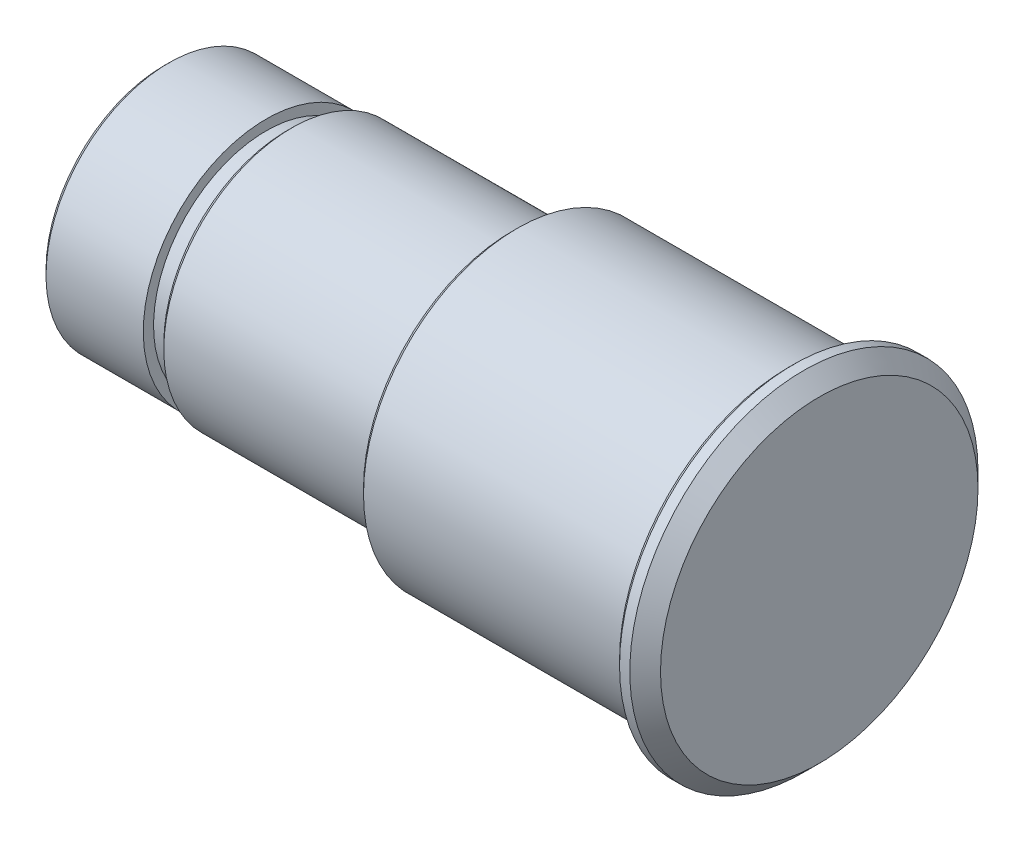
ISO-10303-21;
HEADER;
FILE_DESCRIPTION(('STEP AP214'),'2;1');
FILE_NAME('part.step','',(''),(''),'','','');
FILE_SCHEMA(('AUTOMOTIVE_DESIGN { 1 0 10303 214 1 1 1 1 }'));
ENDSEC;
DATA;
#1=APPLICATION_CONTEXT('core data for automotive mechanical design processes');
#2=APPLICATION_PROTOCOL_DEFINITION('international standard','automotive_design',2000,#1);
#3=PRODUCT_CONTEXT('',#1,'mechanical');
#4=PRODUCT('Part','Part','',(#3));
#5=PRODUCT_RELATED_PRODUCT_CATEGORY('part','',(#4));
#6=PRODUCT_DEFINITION_FORMATION('','',#4);
#7=PRODUCT_DEFINITION_CONTEXT('part definition',#1,'design');
#8=PRODUCT_DEFINITION('design','',#6,#7);
#9=PRODUCT_DEFINITION_SHAPE('','',#8);
#10=(LENGTH_UNIT() NAMED_UNIT(*) SI_UNIT(.MILLI.,.METRE.));
#11=(NAMED_UNIT(*) PLANE_ANGLE_UNIT() SI_UNIT($,.RADIAN.));
#12=(NAMED_UNIT(*) SI_UNIT($,.STERADIAN.) SOLID_ANGLE_UNIT());
#13=UNCERTAINTY_MEASURE_WITH_UNIT(LENGTH_MEASURE(1.E-05),#10,'distance_accuracy_value','');
#14=(GEOMETRIC_REPRESENTATION_CONTEXT(3) GLOBAL_UNCERTAINTY_ASSIGNED_CONTEXT((#13)) GLOBAL_UNIT_ASSIGNED_CONTEXT((#10,
#11,#12)) REPRESENTATION_CONTEXT('',''));
#15=CARTESIAN_POINT('',(0.,0.,0.));
#16=DIRECTION('',(0.,0.,1.));
#17=DIRECTION('',(1.,0.,0.));
#18=AXIS2_PLACEMENT_3D('',#15,#16,#17);
#19=CARTESIAN_POINT('',(0.,0.,0.));
#20=DIRECTION('',(-1.,0.,0.));
#21=DIRECTION('',(0.,0.,1.));
#22=AXIS2_PLACEMENT_3D('',#19,#20,#21);
#23=PLANE('',#22);
#24=DIRECTION('',(0.,1.,0.));
#25=VECTOR('',#24,1.);
#26=CARTESIAN_POINT('',(0.,-17.001,-2.5));
#27=LINE('',#26,#25);
#28=CARTESIAN_POINT('',(0.,-11.2249721603218,-2.5));
#29=VERTEX_POINT('',#28);
#30=CARTESIAN_POINT('',(0.,-9.,-2.5));
#31=VERTEX_POINT('',#30);
#32=EDGE_CURVE('E103',#29,#31,#27,.T.);
#33=ORIENTED_EDGE('',*,*,#32,.T.);
#34=DIRECTION('',(0.,0.,1.));
#35=VECTOR('',#34,1.);
#36=CARTESIAN_POINT('',(0.,-9.,2.5));
#37=LINE('',#36,#35);
#38=CARTESIAN_POINT('',(0.,-9.,2.5));
#39=VERTEX_POINT('',#38);
#40=EDGE_CURVE('E123',#31,#39,#37,.T.);
#41=ORIENTED_EDGE('',*,*,#40,.T.);
#42=DIRECTION('',(0.,1.,0.));
#43=VECTOR('',#42,1.);
#44=CARTESIAN_POINT('',(0.,-17.001,2.5));
#45=LINE('',#44,#43);
#46=CARTESIAN_POINT('',(0.,-11.2249721603218,2.5));
#47=VERTEX_POINT('',#46);
#48=EDGE_CURVE('E122',#47,#39,#45,.T.);
#49=ORIENTED_EDGE('',*,*,#48,.F.);
#50=CARTESIAN_POINT('',(0.,0.,0.));
#51=DIRECTION('',(-1.,0.,0.));
#52=DIRECTION('',(0.,0.,1.));
#53=AXIS2_PLACEMENT_3D('',#50,#51,#52);
#54=CIRCLE('',#53,11.5);
#55=EDGE_CURVE('E11',#47,#29,#54,.T.);
#56=ORIENTED_EDGE('',*,*,#55,.T.);
#57=EDGE_LOOP('',(#33,#41,#49,#56));
#58=FACE_BOUND('',#57,.T.);
#59=ADVANCED_FACE('F39',(#58),#23,.T.);
#60=CARTESIAN_POINT('',(0.,0.,0.));
#61=DIRECTION('',(1.,0.,0.));
#62=DIRECTION('',(0.,0.,-1.));
#63=AXIS2_PLACEMENT_3D('',#60,#61,#62);
#64=CYLINDRICAL_SURFACE('',#63,12.);
#65=DIRECTION('',(1.,0.,0.));
#66=VECTOR('',#65,1.);
#67=CARTESIAN_POINT('',(0.,-11.7366945943055,-2.5));
#68=LINE('',#67,#66);
#69=CARTESIAN_POINT('',(9.5,-11.7366945943055,-2.5));
#70=VERTEX_POINT('',#69);
#71=CARTESIAN_POINT('',(0.500000000000009,-11.7366945943055,-2.5));
#72=VERTEX_POINT('',#71);
#73=EDGE_CURVE('E180',#70,#72,#68,.F.);
#74=ORIENTED_EDGE('',*,*,#73,.T.);
#75=CARTESIAN_POINT('',(0.500000000000009,0.,0.));
#76=DIRECTION('',(-1.,0.,0.));
#77=DIRECTION('',(0.,0.,1.));
#78=AXIS2_PLACEMENT_3D('',#75,#76,#77);
#79=CIRCLE('',#78,12.);
#80=CARTESIAN_POINT('',(0.500000000000009,-11.7366945943055,2.5));
#81=VERTEX_POINT('',#80);
#82=EDGE_CURVE('E48',#72,#81,#79,.F.);
#83=ORIENTED_EDGE('',*,*,#82,.T.);
#84=DIRECTION('',(1.,0.,0.));
#85=VECTOR('',#84,1.);
#86=CARTESIAN_POINT('',(0.,-11.7366945943055,2.5));
#87=LINE('',#86,#85);
#88=CARTESIAN_POINT('',(9.5,-11.7366945943055,2.5));
#89=VERTEX_POINT('',#88);
#90=EDGE_CURVE('E55',#81,#89,#87,.T.);
#91=ORIENTED_EDGE('',*,*,#90,.T.);
#92=CARTESIAN_POINT('',(9.5,-11.7366945943055,2.5));
#93=CARTESIAN_POINT('',(9.58421858663514,-11.7367140999484,2.49997489475119));
#94=CARTESIAN_POINT('',(9.66799454675436,-11.7376109802893,2.49575315399786));
#95=CARTESIAN_POINT('',(9.83466121341523,-11.7411594903559,2.47891640153729));
#96=CARTESIAN_POINT('',(9.91755191996268,-11.74381112007,2.46630138988501));
#97=CARTESIAN_POINT('',(10.,-11.7473401244707,2.44948974278318));
#98=B_SPLINE_CURVE_WITH_KNOTS('',3,(#92,#93,#94,#95,#96,#97),.UNSPECIFIED.,.F.,.F.,(4,2,4),(0.,
0.251661182642632,0.503322363637155),.UNSPECIFIED.);
#99=CARTESIAN_POINT('',(10.,-11.7473401244707,2.44948974278318));
#100=VERTEX_POINT('',#99);
#101=EDGE_CURVE('E119',#89,#100,#98,.T.);
#102=ORIENTED_EDGE('',*,*,#101,.T.);
#103=CARTESIAN_POINT('',(10.,0.,0.));
#104=DIRECTION('',(1.,0.,0.));
#105=DIRECTION('',(0.,0.,-1.));
#106=AXIS2_PLACEMENT_3D('',#103,#104,#105);
#107=CIRCLE('',#106,12.);
#108=CARTESIAN_POINT('',(10.,-11.7473401244707,-2.44948974278318));
#109=VERTEX_POINT('',#108);
#110=EDGE_CURVE('E219',#109,#100,#107,.T.);
#111=ORIENTED_EDGE('',*,*,#110,.F.);
#112=CARTESIAN_POINT('',(10.,-11.7473401244707,-2.44948974278318));
#113=CARTESIAN_POINT('',(9.91755191996268,-11.74381112007,-2.46630138988501));
#114=CARTESIAN_POINT('',(9.83466121341523,-11.7411594903559,-2.47891640153729));
#115=CARTESIAN_POINT('',(9.66799454675437,-11.7376109802893,-2.49575315399786));
#116=CARTESIAN_POINT('',(9.58421858663515,-11.7367140999484,-2.49997489475119));
#117=CARTESIAN_POINT('',(9.5,-11.7366945943055,-2.5));
#118=B_SPLINE_CURVE_WITH_KNOTS('',3,(#112,#113,#114,#115,#116,#117),.UNSPECIFIED.,.F.,.F.,(4,2,
4),(0.,0.251661180994519,0.503322363637153),.UNSPECIFIED.);
#119=EDGE_CURVE('E173',#109,#70,#118,.T.);
#120=ORIENTED_EDGE('',*,*,#119,.T.);
#121=EDGE_LOOP('',(#74,#83,#91,#102,#111,#120));
#122=FACE_BOUND('',#121,.T.);
#123=ADVANCED_FACE('F191',(#122),#64,.T.);
#124=CARTESIAN_POINT('',(10.,12.,0.));
#125=DIRECTION('',(1.,0.,0.));
#126=DIRECTION('',(0.,0.,-1.));
#127=AXIS2_PLACEMENT_3D('',#124,#125,#126);
#128=PLANE('',#127);
#129=DIRECTION('',(0.,1.,0.));
#130=VECTOR('',#129,1.);
#131=CARTESIAN_POINT('',(10.,-17.001,-2.44948974278318));
#132=LINE('',#131,#130);
#133=CARTESIAN_POINT('',(10.,-10.7238052947636,-2.44948974278318));
#134=VERTEX_POINT('',#133);
#135=EDGE_CURVE('E199',#134,#109,#132,.F.);
#136=ORIENTED_EDGE('',*,*,#135,.T.);
#137=ORIENTED_EDGE('',*,*,#110,.T.);
#138=DIRECTION('',(0.,1.,0.));
#139=VECTOR('',#138,1.);
#140=CARTESIAN_POINT('',(10.,-17.001,2.44948974278318));
#141=LINE('',#140,#139);
#142=CARTESIAN_POINT('',(10.,-10.7238052947636,2.44948974278318));
#143=VERTEX_POINT('',#142);
#144=EDGE_CURVE('E208',#100,#143,#141,.T.);
#145=ORIENTED_EDGE('',*,*,#144,.T.);
#146=CARTESIAN_POINT('',(10.,0.,0.));
#147=DIRECTION('',(1.,0.,0.));
#148=DIRECTION('',(0.,0.,-1.));
#149=AXIS2_PLACEMENT_3D('',#146,#147,#148);
#150=CIRCLE('',#149,11.);
#151=EDGE_CURVE('E217',#134,#143,#150,.T.);
#152=ORIENTED_EDGE('',*,*,#151,.F.);
#153=EDGE_LOOP('',(#136,#137,#145,#152));
#154=FACE_BOUND('',#153,.T.);
#155=ADVANCED_FACE('F280',(#154),#128,.T.);
#156=CARTESIAN_POINT('',(0.,0.,0.));
#157=DIRECTION('',(1.,0.,0.));
#158=DIRECTION('',(0.,0.,-1.));
#159=AXIS2_PLACEMENT_3D('',#156,#157,#158);
#160=CYLINDRICAL_SURFACE('',#159,11.);
#161=CARTESIAN_POINT('',(10.,-10.7238052947636,2.44948974278318));
#162=CARTESIAN_POINT('',(10.0687658541219,-10.7270056140935,2.43546029800012));
#163=CARTESIAN_POINT('',(10.1369024025991,-10.7308483129835,2.41852849317044));
#164=CARTESIAN_POINT('',(10.2714339922325,-10.7396759330596,2.37903219978379));
#165=CARTESIAN_POINT('',(10.3378293544249,-10.7446606420105,2.35646875776078));
#166=CARTESIAN_POINT('',(10.4683290356998,-10.7556232664351,2.3059117370436));
#167=CARTESIAN_POINT('',(10.5324364679775,-10.7615997644778,2.27792589842313));
#168=CARTESIAN_POINT('',(10.6580046328132,-10.7743708943376,2.21673402022404));
#169=CARTESIAN_POINT('',(10.7194652993342,-10.7811655465517,2.18352785049374));
#170=CARTESIAN_POINT('',(10.8992302745031,-10.802487441033,2.07643102930596));
#171=CARTESIAN_POINT('',(11.0130549552139,-10.8179647932573,1.99500860974427));
#172=CARTESIAN_POINT('',(11.2254548650035,-10.8497057285349,1.81446040223466));
#173=CARTESIAN_POINT('',(11.3240279673745,-10.8659694208225,1.7153321494977));
#174=CARTESIAN_POINT('',(11.5046141676335,-10.8977273916412,1.50048852036224));
#175=CARTESIAN_POINT('',(11.5863835486118,-10.913208181084,1.38456569984476));
#176=CARTESIAN_POINT('',(11.7292834613016,-10.9414247771705,1.1403141507048));
#177=CARTESIAN_POINT('',(11.7904137955471,-10.9541605575507,1.01198530340163));
#178=CARTESIAN_POINT('',(11.8897789476618,-10.9753675759204,0.747502423487413));
#179=CARTESIAN_POINT('',(11.9281808789883,-10.9838698657884,0.611413782178589));
#180=CARTESIAN_POINT('',(11.9815268235188,-10.9957850389368,0.334509194933948));
#181=CARTESIAN_POINT('',(11.9964754107153,-10.9991989145795,0.193694176233572));
#182=CARTESIAN_POINT('',(12.0023505810677,-11.0005342905738,-0.0853038567361098));
#183=CARTESIAN_POINT('',(11.9938061401631,-10.9985767376126,-0.223475426347411));
#184=CARTESIAN_POINT('',(11.9541061833004,-10.9896436624435,-0.496360415596153));
#185=CARTESIAN_POINT('',(11.9229504646779,-10.9826680952593,-0.63107380422679));
#186=CARTESIAN_POINT('',(11.8391470519055,-10.9644859951713,-0.892877436761513));
#187=CARTESIAN_POINT('',(11.7865634801624,-10.9532920930025,-1.0199891382797));
#188=CARTESIAN_POINT('',(11.6614690078716,-10.9278640241393,-1.26364984056604));
#189=CARTESIAN_POINT('',(11.5889574642254,-10.9136297593323,-1.38019850029136));
#190=CARTESIAN_POINT('',(11.4243216269016,-10.8833059648609,-1.60201524380022));
#191=CARTESIAN_POINT('',(11.3318260593767,-10.8671844082587,-1.70700339971072));
#192=CARTESIAN_POINT('',(11.1305726501864,-10.8350782584726,-1.90018320188437));
#193=CARTESIAN_POINT('',(11.0218052105985,-10.8190937520506,-1.98836486460063));
#194=CARTESIAN_POINT('',(10.7892227814059,-10.7888185846139,-2.14662318594159));
#195=CARTESIAN_POINT('',(10.6652103520707,-10.7745562305443,-2.21641509231995));
#196=CARTESIAN_POINT('',(10.4070406302536,-10.7497143390022,-2.33394491521171));
#197=CARTESIAN_POINT('',(10.2729075824992,-10.7391263202757,-2.38173370476181));
#198=CARTESIAN_POINT('',(10.0907827016322,-10.7283244592824,-2.42964225460225));
#199=CARTESIAN_POINT('',(10.0455175386513,-10.7259222401423,-2.44020769271175));
#200=CARTESIAN_POINT('',(10.,-10.7238052947636,-2.44948974278318));
#201=B_SPLINE_CURVE_WITH_KNOTS('',3,(#161,#162,#163,#164,#165,#166,#167,#168,#169,#170,#171,
#172,#173,#174,#175,#176,#177,#178,#179,#180,#181,#182,#183,#184,#185,#186,#187,#188,#189,#190,
#191,#192,#193,#194,#195,#196,#197,#198,#199,#200),.UNSPECIFIED.,.F.,.F.,(4,2,2,2,2,2,2,2,2,2,2,
2,2,2,2,2,2,2,2,4),(0.,0.210689583247731,0.421340042908846,0.631692000703381,0.842049203760208,
1.26232536136261,1.68266007032214,2.10871720228515,2.5347784104734,2.95766672725566,
3.38047255991519,3.79383680545741,4.20720475601969,4.61934469068557,5.03149792713857,
5.45209251439053,5.87293617364216,6.29995715537314,6.72598580895303,6.86553673386692),.UNSPECIFIED.);
#202=CARTESIAN_POINT('',(12.,-11.,0.));
#203=VERTEX_POINT('',#202);
#204=EDGE_CURVE('E63',#203,#134,#201,.T.);
#205=ORIENTED_EDGE('',*,*,#204,.T.);
#206=ORIENTED_EDGE('',*,*,#151,.T.);
#207=EDGE_CURVE('E194',#143,#203,#201,.T.);
#208=ORIENTED_EDGE('',*,*,#207,.T.);
#209=CARTESIAN_POINT('',(12.,0.,0.));
#210=DIRECTION('',(1.,0.,0.));
#211=DIRECTION('',(0.,0.,-1.));
#212=AXIS2_PLACEMENT_3D('',#209,#210,#211);
#213=CIRCLE('',#212,11.);
#214=EDGE_CURVE('E214',#203,#203,#213,.T.);
#215=ORIENTED_EDGE('',*,*,#214,.F.);
#216=EDGE_LOOP('',(#205,#206,#208,#215));
#217=FACE_BOUND('',#216,.T.);
#218=ADVANCED_FACE('F273',(#217),#160,.T.);
#219=CARTESIAN_POINT('',(12.,11.,0.));
#220=DIRECTION('',(-1.,0.,0.));
#221=DIRECTION('',(0.,0.,1.));
#222=AXIS2_PLACEMENT_3D('',#219,#220,#221);
#223=PLANE('',#222);
#224=CARTESIAN_POINT('',(12.,0.,0.));
#225=DIRECTION('',(-1.,0.,0.));
#226=DIRECTION('',(0.,0.,1.));
#227=AXIS2_PLACEMENT_3D('',#224,#225,#226);
#228=CIRCLE('',#227,12.);
#229=CARTESIAN_POINT('',(12.,0.,12.));
#230=VERTEX_POINT('',#229);
#231=EDGE_CURVE('E248',#230,#230,#228,.T.);
#232=ORIENTED_EDGE('',*,*,#231,.T.);
#233=EDGE_LOOP('',(#232));
#234=FACE_BOUND('',#233,.T.);
#235=ORIENTED_EDGE('',*,*,#214,.T.);
#236=EDGE_LOOP('',(#235));
#237=FACE_BOUND('',#236,.T.);
#238=ADVANCED_FACE('F252',(#234,#237),#223,.T.);
#239=CARTESIAN_POINT('',(0.,0.,0.));
#240=DIRECTION('',(1.,0.,0.));
#241=DIRECTION('',(0.,0.,-1.));
#242=AXIS2_PLACEMENT_3D('',#239,#240,#241);
#243=CYLINDRICAL_SURFACE('',#242,12.5);
#244=CARTESIAN_POINT('',(33.5,0.,0.));
#245=DIRECTION('',(-1.,0.,0.));
#246=DIRECTION('',(0.,0.,1.));
#247=AXIS2_PLACEMENT_3D('',#244,#245,#246);
#248=CIRCLE('',#247,12.5);
#249=CARTESIAN_POINT('',(33.5,0.,12.5));
#250=VERTEX_POINT('',#249);
#251=EDGE_CURVE('E239',#250,#250,#248,.T.);
#252=ORIENTED_EDGE('',*,*,#251,.T.);
#253=EDGE_LOOP('',(#252));
#254=FACE_BOUND('',#253,.T.);
#255=CARTESIAN_POINT('',(12.5,0.,0.));
#256=DIRECTION('',(-1.,0.,0.));
#257=DIRECTION('',(0.,0.,1.));
#258=AXIS2_PLACEMENT_3D('',#255,#256,#257);
#259=CIRCLE('',#258,12.5);
#260=CARTESIAN_POINT('',(12.5,0.,12.5));
#261=VERTEX_POINT('',#260);
#262=EDGE_CURVE('E236',#261,#261,#259,.F.);
#263=ORIENTED_EDGE('',*,*,#262,.T.);
#264=EDGE_LOOP('',(#263));
#265=FACE_BOUND('',#264,.T.);
#266=ADVANCED_FACE('F261',(#254,#265),#243,.T.);
#267=CARTESIAN_POINT('',(34.,12.5,0.));
#268=DIRECTION('',(-1.,0.,0.));
#269=DIRECTION('',(0.,0.,1.));
#270=AXIS2_PLACEMENT_3D('',#267,#268,#269);
#271=PLANE('',#270);
#272=CARTESIAN_POINT('',(34.,0.,0.));
#273=DIRECTION('',(-1.,0.,0.));
#274=DIRECTION('',(0.,0.,1.));
#275=AXIS2_PLACEMENT_3D('',#272,#273,#274);
#276=CIRCLE('',#275,14.5);
#277=CARTESIAN_POINT('',(34.,0.,14.5));
#278=VERTEX_POINT('',#277);
#279=EDGE_CURVE('E233',#278,#278,#276,.T.);
#280=ORIENTED_EDGE('',*,*,#279,.T.);
#281=EDGE_LOOP('',(#280));
#282=FACE_BOUND('',#281,.T.);
#283=CARTESIAN_POINT('',(34.,0.,0.));
#284=DIRECTION('',(-1.,0.,0.));
#285=DIRECTION('',(0.,0.,1.));
#286=AXIS2_PLACEMENT_3D('',#283,#284,#285);
#287=CIRCLE('',#286,13.);
#288=CARTESIAN_POINT('',(34.,0.,13.));
#289=VERTEX_POINT('',#288);
#290=EDGE_CURVE('E230',#289,#289,#287,.F.);
#291=ORIENTED_EDGE('',*,*,#290,.T.);
#292=EDGE_LOOP('',(#291));
#293=FACE_BOUND('',#292,.T.);
#294=ADVANCED_FACE('F263',(#282,#293),#271,.T.);
#295=CARTESIAN_POINT('',(0.,0.,0.));
#296=DIRECTION('',(1.,0.,0.));
#297=DIRECTION('',(0.,0.,-1.));
#298=AXIS2_PLACEMENT_3D('',#295,#296,#297);
#299=CYLINDRICAL_SURFACE('',#298,15.);
#300=CARTESIAN_POINT('',(34.5,0.,0.));
#301=DIRECTION('',(-1.,0.,0.));
#302=DIRECTION('',(0.,0.,1.));
#303=AXIS2_PLACEMENT_3D('',#300,#301,#302);
#304=CIRCLE('',#303,15.);
#305=CARTESIAN_POINT('',(34.5,0.,15.));
#306=VERTEX_POINT('',#305);
#307=EDGE_CURVE('E227',#306,#306,#304,.F.);
#308=ORIENTED_EDGE('',*,*,#307,.T.);
#309=EDGE_LOOP('',(#308));
#310=FACE_BOUND('',#309,.T.);
#311=CARTESIAN_POINT('',(61.,0.,0.));
#312=DIRECTION('',(1.,0.,0.));
#313=DIRECTION('',(0.,0.,-1.));
#314=AXIS2_PLACEMENT_3D('',#311,#312,#313);
#315=CIRCLE('',#314,15.);
#316=CARTESIAN_POINT('',(61.,0.,-15.));
#317=VERTEX_POINT('',#316);
#318=EDGE_CURVE('E211',#317,#317,#315,.T.);
#319=ORIENTED_EDGE('',*,*,#318,.F.);
#320=EDGE_LOOP('',(#319));
#321=FACE_BOUND('',#320,.T.);
#322=ADVANCED_FACE('F270',(#310,#321),#299,.T.);
#323=CARTESIAN_POINT('',(61.,15.,0.));
#324=DIRECTION('',(-1.,0.,0.));
#325=DIRECTION('',(0.,0.,1.));
#326=AXIS2_PLACEMENT_3D('',#323,#324,#325);
#327=PLANE('',#326);
#328=CARTESIAN_POINT('',(61.,0.,0.));
#329=DIRECTION('',(-1.,0.,0.));
#330=DIRECTION('',(0.,0.,1.));
#331=AXIS2_PLACEMENT_3D('',#328,#329,#330);
#332=CIRCLE('',#331,16.5);
#333=CARTESIAN_POINT('',(61.,0.,16.5));
#334=VERTEX_POINT('',#333);
#335=EDGE_CURVE('E245',#334,#334,#332,.T.);
#336=ORIENTED_EDGE('',*,*,#335,.T.);
#337=EDGE_LOOP('',(#336));
#338=FACE_BOUND('',#337,.T.);
#339=ORIENTED_EDGE('',*,*,#318,.T.);
#340=EDGE_LOOP('',(#339));
#341=FACE_BOUND('',#340,.T.);
#342=ADVANCED_FACE('F325',(#338,#341),#327,.T.);
#343=CARTESIAN_POINT('',(0.,0.,0.));
#344=DIRECTION('',(1.,0.,0.));
#345=DIRECTION('',(0.,0.,-1.));
#346=AXIS2_PLACEMENT_3D('',#343,#344,#345);
#347=CYLINDRICAL_SURFACE('',#346,17.);
#348=CARTESIAN_POINT('',(61.5,0.,0.));
#349=DIRECTION('',(-1.,0.,0.));
#350=DIRECTION('',(0.,0.,1.));
#351=AXIS2_PLACEMENT_3D('',#348,#349,#350);
#352=CIRCLE('',#351,17.);
#353=CARTESIAN_POINT('',(61.5,0.,17.));
#354=VERTEX_POINT('',#353);
#355=EDGE_CURVE('E242',#354,#354,#352,.F.);
#356=ORIENTED_EDGE('',*,*,#355,.T.);
#357=EDGE_LOOP('',(#356));
#358=FACE_BOUND('',#357,.T.);
#359=CARTESIAN_POINT('',(62.5,0.,0.));
#360=DIRECTION('',(1.,0.,0.));
#361=DIRECTION('',(0.,0.,-1.));
#362=AXIS2_PLACEMENT_3D('',#359,#360,#361);
#363=CIRCLE('',#362,17.);
#364=CARTESIAN_POINT('',(62.5,0.,-17.));
#365=VERTEX_POINT('',#364);
#366=EDGE_CURVE('E224',#365,#365,#363,.F.);
#367=ORIENTED_EDGE('',*,*,#366,.T.);
#368=EDGE_LOOP('',(#367));
#369=FACE_BOUND('',#368,.T.);
#370=ADVANCED_FACE('F322',(#358,#369),#347,.T.);
#371=CARTESIAN_POINT('',(64.,17.,0.));
#372=DIRECTION('',(1.,0.,0.));
#373=DIRECTION('',(0.,0.,-1.));
#374=AXIS2_PLACEMENT_3D('',#371,#372,#373);
#375=PLANE('',#374);
#376=CARTESIAN_POINT('',(64.,0.,0.));
#377=DIRECTION('',(1.,0.,0.));
#378=DIRECTION('',(0.,0.,-1.));
#379=AXIS2_PLACEMENT_3D('',#376,#377,#378);
#380=CIRCLE('',#379,15.5);
#381=CARTESIAN_POINT('',(64.,0.,-15.5));
#382=VERTEX_POINT('',#381);
#383=EDGE_CURVE('E221',#382,#382,#380,.T.);
#384=ORIENTED_EDGE('',*,*,#383,.T.);
#385=EDGE_LOOP('',(#384));
#386=FACE_BOUND('',#385,.T.);
#387=ADVANCED_FACE('F292',(#386),#375,.T.);
#388=CARTESIAN_POINT('',(64.,0.,0.));
#389=DIRECTION('',(-1.,0.,0.));
#390=DIRECTION('',(0.,0.,1.));
#391=AXIS2_PLACEMENT_3D('',#388,#389,#390);
#392=CONICAL_SURFACE('',#391,15.5,0.785398163397446);
#393=ORIENTED_EDGE('',*,*,#366,.F.);
#394=EDGE_LOOP('',(#393));
#395=FACE_BOUND('',#394,.T.);
#396=ORIENTED_EDGE('',*,*,#383,.F.);
#397=EDGE_LOOP('',(#396));
#398=FACE_BOUND('',#397,.T.);
#399=ADVANCED_FACE('F285',(#395,#398),#392,.T.);
#400=CARTESIAN_POINT('',(34.5,0.,0.));
#401=DIRECTION('',(1.,0.,0.));
#402=DIRECTION('',(0.,0.,-1.));
#403=AXIS2_PLACEMENT_3D('',#400,#401,#402);
#404=CONICAL_SURFACE('',#403,15.,0.78539816339745);
#405=ORIENTED_EDGE('',*,*,#279,.F.);
#406=EDGE_LOOP('',(#405));
#407=FACE_BOUND('',#406,.T.);
#408=ORIENTED_EDGE('',*,*,#307,.F.);
#409=EDGE_LOOP('',(#408));
#410=FACE_BOUND('',#409,.T.);
#411=ADVANCED_FACE('F291',(#407,#410),#404,.T.);
#412=CARTESIAN_POINT('',(34.,0.,0.));
#413=DIRECTION('',(1.,0.,0.));
#414=DIRECTION('',(0.,0.,-1.));
#415=AXIS2_PLACEMENT_3D('',#412,#413,#414);
#416=CONICAL_SURFACE('',#415,13.,0.785398163397464);
#417=ORIENTED_EDGE('',*,*,#251,.F.);
#418=EDGE_LOOP('',(#417));
#419=FACE_BOUND('',#418,.T.);
#420=ORIENTED_EDGE('',*,*,#290,.F.);
#421=EDGE_LOOP('',(#420));
#422=FACE_BOUND('',#421,.T.);
#423=ADVANCED_FACE('F299',(#419,#422),#416,.T.);
#424=CARTESIAN_POINT('',(61.5,0.,0.));
#425=DIRECTION('',(1.,0.,0.));
#426=DIRECTION('',(0.,0.,-1.));
#427=AXIS2_PLACEMENT_3D('',#424,#425,#426);
#428=CONICAL_SURFACE('',#427,17.,0.785398163397448);
#429=ORIENTED_EDGE('',*,*,#335,.F.);
#430=EDGE_LOOP('',(#429));
#431=FACE_BOUND('',#430,.T.);
#432=ORIENTED_EDGE('',*,*,#355,.F.);
#433=EDGE_LOOP('',(#432));
#434=FACE_BOUND('',#433,.T.);
#435=ADVANCED_FACE('F258',(#431,#434),#428,.T.);
#436=CARTESIAN_POINT('',(12.5,0.,0.));
#437=DIRECTION('',(1.,0.,0.));
#438=DIRECTION('',(0.,0.,-1.));
#439=AXIS2_PLACEMENT_3D('',#436,#437,#438);
#440=CONICAL_SURFACE('',#439,12.5,0.78539816339745);
#441=ORIENTED_EDGE('',*,*,#231,.F.);
#442=EDGE_LOOP('',(#441));
#443=FACE_BOUND('',#442,.T.);
#444=ORIENTED_EDGE('',*,*,#262,.F.);
#445=EDGE_LOOP('',(#444));
#446=FACE_BOUND('',#445,.T.);
#447=ADVANCED_FACE('F255',(#443,#446),#440,.T.);
#448=CARTESIAN_POINT('',(0.500000000000009,0.,0.));
#449=DIRECTION('',(1.,0.,0.));
#450=DIRECTION('',(0.,0.,-1.));
#451=AXIS2_PLACEMENT_3D('',#448,#449,#450);
#452=CONICAL_SURFACE('',#451,12.,0.785398163397441);
#453=CARTESIAN_POINT('',(3.54158126514912,-14.83236889226,-2.5));
#454=CARTESIAN_POINT('',(3.26569685109738,-14.5525915737725,-2.5));
#455=CARTESIAN_POINT('',(2.98991984449323,-14.272708408603,-2.5));
#456=CARTESIAN_POINT('',(2.43862645060569,-13.7126850039011,-2.5));
#457=CARTESIAN_POINT('',(2.16311006357393,-13.432544764121,-2.5));
#458=CARTESIAN_POINT('',(1.33702904252298,-12.5916790148147,-2.5));
#459=CARTESIAN_POINT('',(0.786924825493423,-12.03050064843,-2.5));
#460=CARTESIAN_POINT('',(-0.0368487626011552,-11.1873757609135,-2.5));
#461=CARTESIAN_POINT('',(-0.311211058300592,-10.9061063057831,-2.5));
#462=CARTESIAN_POINT('',(-0.859349717290499,-10.3429976012595,-2.5));
#463=CARTESIAN_POINT('',(-1.13312608132521,-10.061158352591,-2.5));
#464=CARTESIAN_POINT('',(-1.67994359277765,-9.49675963435256,-2.5));
#465=CARTESIAN_POINT('',(-1.95298473027587,-9.21420015516456,-2.5));
#466=CARTESIAN_POINT('',(-2.49808294278046,-8.64813145270999,-2.5));
#467=CARTESIAN_POINT('',(-2.77014001343467,-8.36462222525367,-2.5));
#468=CARTESIAN_POINT('',(-3.04158126514911,-8.08052272406168,-2.5));
#469=B_SPLINE_CURVE_WITH_KNOTS('',3,(#453,#454,#455,#456,#457,#458,#459,#460,#461,#462,#463,
#464,#465,#466,#467,#468),.UNSPECIFIED.,.F.,.F.,(4,2,2,2,2,2,2,4),(0.,1.17876530941275,
2.35753175576147,4.71503166134844,5.8937950175363,7.07255687559171,8.25133455834035,
9.43011744804055),.UNSPECIFIED.);
#470=EDGE_CURVE('E106',#72,#29,#469,.T.);
#471=ORIENTED_EDGE('',*,*,#470,.T.);
#472=ORIENTED_EDGE('',*,*,#55,.F.);
#473=CARTESIAN_POINT('',(-3.0415812651491,-8.08052272406169,2.5));
#474=CARTESIAN_POINT('',(-2.77014001343466,-8.36462222525368,2.5));
#475=CARTESIAN_POINT('',(-2.49808294278046,-8.64813145270999,2.5));
#476=CARTESIAN_POINT('',(-1.95298473027587,-9.21420015516456,2.5));
#477=CARTESIAN_POINT('',(-1.67994359277764,-9.49675963435256,2.5));
#478=CARTESIAN_POINT('',(-1.1331260813252,-10.061158352591,2.5));
#479=CARTESIAN_POINT('',(-0.859349717290497,-10.3429976012595,2.5));
#480=CARTESIAN_POINT('',(-0.311211058300591,-10.9061063057831,2.5));
#481=CARTESIAN_POINT('',(-0.036848762601154,-11.1873757609135,2.5));
#482=CARTESIAN_POINT('',(0.786924825493423,-12.03050064843,2.5));
#483=CARTESIAN_POINT('',(1.33702904252298,-12.5916790148147,2.5));
#484=CARTESIAN_POINT('',(2.16311006357393,-13.432544764121,2.5));
#485=CARTESIAN_POINT('',(2.43862645060569,-13.7126850039011,2.5));
#486=CARTESIAN_POINT('',(2.98991984449323,-14.272708408603,2.5));
#487=CARTESIAN_POINT('',(3.26569685109738,-14.5525915737725,2.5));
#488=CARTESIAN_POINT('',(3.54158126514912,-14.83236889226,2.5));
#489=B_SPLINE_CURVE_WITH_KNOTS('',3,(#473,#474,#475,#476,#477,#478,#479,#480,#481,#482,#483,
#484,#485,#486,#487,#488),.UNSPECIFIED.,.F.,.F.,(4,2,2,2,2,2,2,4),(0.,1.1787828897002,
2.35756057244884,3.53632243050425,4.71508578669211,7.07258569227908,8.25135213862779,
9.43011744804054),.UNSPECIFIED.);
#490=EDGE_CURVE('E112',#47,#81,#489,.T.);
#491=ORIENTED_EDGE('',*,*,#490,.T.);
#492=ORIENTED_EDGE('',*,*,#82,.F.);
#493=EDGE_LOOP('',(#471,#472,#491,#492));
#494=FACE_BOUND('',#493,.T.);
#495=ADVANCED_FACE('F42',(#494),#452,.T.);
#496=CARTESIAN_POINT('',(0.,-17.001,-2.5));
#497=DIRECTION('',(0.,0.,-1.));
#498=DIRECTION('',(-1.,0.,0.));
#499=AXIS2_PLACEMENT_3D('',#496,#497,#498);
#500=PLANE('',#499);
#501=DIRECTION('',(0.,1.,0.));
#502=VECTOR('',#501,1.);
#503=CARTESIAN_POINT('',(9.5,-17.001,-2.5));
#504=LINE('',#503,#502);
#505=CARTESIAN_POINT('',(9.5,-9.,-2.5));
#506=VERTEX_POINT('',#505);
#507=EDGE_CURVE('E113',#70,#506,#504,.T.);
#508=ORIENTED_EDGE('',*,*,#507,.T.);
#509=DIRECTION('',(-1.,0.,0.));
#510=VECTOR('',#509,1.);
#511=CARTESIAN_POINT('',(0.,-9.,-2.5));
#512=LINE('',#511,#510);
#513=EDGE_CURVE('E109',#506,#31,#512,.T.);
#514=ORIENTED_EDGE('',*,*,#513,.T.);
#515=ORIENTED_EDGE('',*,*,#32,.F.);
#516=ORIENTED_EDGE('',*,*,#470,.F.);
#517=ORIENTED_EDGE('',*,*,#73,.F.);
#518=EDGE_LOOP('',(#508,#514,#515,#516,#517));
#519=FACE_BOUND('',#518,.T.);
#520=ADVANCED_FACE('F105',(#519),#500,.F.);
#521=CARTESIAN_POINT('',(9.5,-17.001,0.));
#522=DIRECTION('',(0.,1.,0.));
#523=DIRECTION('',(0.,0.,1.));
#524=AXIS2_PLACEMENT_3D('',#521,#522,#523);
#525=CYLINDRICAL_SURFACE('',#524,2.5);
#526=DIRECTION('',(0.,1.,0.));
#527=VECTOR('',#526,1.);
#528=CARTESIAN_POINT('',(9.5,-17.001,2.5));
#529=LINE('',#528,#527);
#530=CARTESIAN_POINT('',(9.5,-9.,2.5));
#531=VERTEX_POINT('',#530);
#532=EDGE_CURVE('E126',#89,#531,#529,.T.);
#533=ORIENTED_EDGE('',*,*,#532,.T.);
#534=CARTESIAN_POINT('',(9.5,-9.,0.));
#535=DIRECTION('',(0.,1.,0.));
#536=DIRECTION('',(0.,0.,-1.));
#537=AXIS2_PLACEMENT_3D('',#534,#535,#536);
#538=CIRCLE('',#537,2.5);
#539=EDGE_CURVE('E129',#531,#506,#538,.T.);
#540=ORIENTED_EDGE('',*,*,#539,.T.);
#541=ORIENTED_EDGE('',*,*,#507,.F.);
#542=ORIENTED_EDGE('',*,*,#119,.F.);
#543=ORIENTED_EDGE('',*,*,#135,.F.);
#544=ORIENTED_EDGE('',*,*,#204,.F.);
#545=ORIENTED_EDGE('',*,*,#207,.F.);
#546=ORIENTED_EDGE('',*,*,#144,.F.);
#547=ORIENTED_EDGE('',*,*,#101,.F.);
#548=EDGE_LOOP('',(#533,#540,#541,#542,#543,#544,#545,#546,#547));
#549=FACE_BOUND('',#548,.T.);
#550=ADVANCED_FACE('F168',(#549),#525,.F.);
#551=CARTESIAN_POINT('',(9.5,-17.001,2.5));
#552=DIRECTION('',(0.,0.,1.));
#553=DIRECTION('',(1.,0.,0.));
#554=AXIS2_PLACEMENT_3D('',#551,#552,#553);
#555=PLANE('',#554);
#556=ORIENTED_EDGE('',*,*,#490,.F.);
#557=ORIENTED_EDGE('',*,*,#48,.T.);
#558=DIRECTION('',(1.,0.,0.));
#559=VECTOR('',#558,1.);
#560=CARTESIAN_POINT('',(9.5,-9.,2.5));
#561=LINE('',#560,#559);
#562=EDGE_CURVE('E183',#39,#531,#561,.T.);
#563=ORIENTED_EDGE('',*,*,#562,.T.);
#564=ORIENTED_EDGE('',*,*,#532,.F.);
#565=ORIENTED_EDGE('',*,*,#90,.F.);
#566=EDGE_LOOP('',(#556,#557,#563,#564,#565));
#567=FACE_BOUND('',#566,.T.);
#568=ADVANCED_FACE('F141',(#567),#555,.F.);
#569=CARTESIAN_POINT('',(9.5,-9.,0.));
#570=DIRECTION('',(0.,-1.,0.));
#571=DIRECTION('',(0.,0.,-1.));
#572=AXIS2_PLACEMENT_3D('',#569,#570,#571);
#573=PLANE('',#572);
#574=ORIENTED_EDGE('',*,*,#40,.F.);
#575=ORIENTED_EDGE('',*,*,#513,.F.);
#576=ORIENTED_EDGE('',*,*,#539,.F.);
#577=ORIENTED_EDGE('',*,*,#562,.F.);
#578=EDGE_LOOP('',(#574,#575,#576,#577));
#579=FACE_BOUND('',#578,.T.);
#580=ADVANCED_FACE('F153',(#579),#573,.T.);
#581=CLOSED_SHELL('',(#59,#123,#155,#218,#238,#266,#294,#322,#342,#370,#387,#399,#411,#423,#435,
#447,#495,#520,#550,#568,#580));
#582=MANIFOLD_SOLID_BREP('B2',#581);
#583=ADVANCED_BREP_SHAPE_REPRESENTATION('',(#18,#582),#14);
#584=SHAPE_DEFINITION_REPRESENTATION(#9,#583);
ENDSEC;
END-ISO-10303-21;
